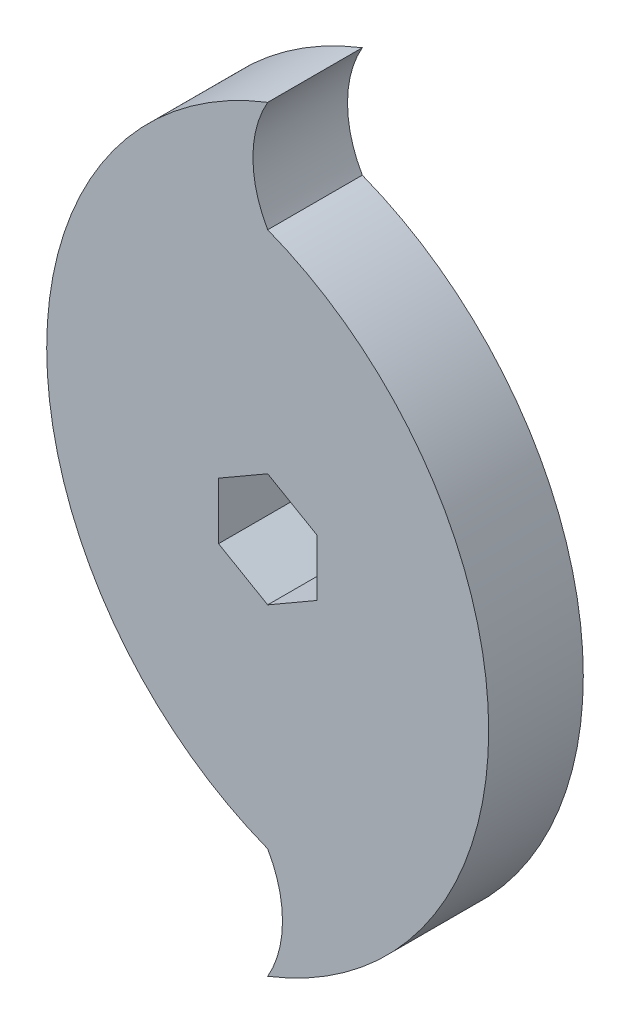
ISO-10303-21;
HEADER;
FILE_DESCRIPTION(('STEP AP214'),'2;1');
FILE_NAME('part.step','',(''),(''),'','','');
FILE_SCHEMA(('AUTOMOTIVE_DESIGN { 1 0 10303 214 1 1 1 1 }'));
ENDSEC;
DATA;
#1=APPLICATION_CONTEXT('core data for automotive mechanical design processes');
#2=APPLICATION_PROTOCOL_DEFINITION('international standard','automotive_design',2000,#1);
#3=PRODUCT_CONTEXT('',#1,'mechanical');
#4=PRODUCT('Part','Part','',(#3));
#5=PRODUCT_RELATED_PRODUCT_CATEGORY('part','',(#4));
#6=PRODUCT_DEFINITION_FORMATION('','',#4);
#7=PRODUCT_DEFINITION_CONTEXT('part definition',#1,'design');
#8=PRODUCT_DEFINITION('design','',#6,#7);
#9=PRODUCT_DEFINITION_SHAPE('','',#8);
#10=(LENGTH_UNIT() NAMED_UNIT(*) SI_UNIT(.MILLI.,.METRE.));
#11=(NAMED_UNIT(*) PLANE_ANGLE_UNIT() SI_UNIT($,.RADIAN.));
#12=(NAMED_UNIT(*) SI_UNIT($,.STERADIAN.) SOLID_ANGLE_UNIT());
#13=UNCERTAINTY_MEASURE_WITH_UNIT(LENGTH_MEASURE(1.E-05),#10,'distance_accuracy_value','');
#14=(GEOMETRIC_REPRESENTATION_CONTEXT(3) GLOBAL_UNCERTAINTY_ASSIGNED_CONTEXT((#13)) GLOBAL_UNIT_ASSIGNED_CONTEXT((#10,
#11,#12)) REPRESENTATION_CONTEXT('',''));
#15=CARTESIAN_POINT('',(0.,0.,0.));
#16=DIRECTION('',(0.,0.,1.));
#17=DIRECTION('',(1.,0.,0.));
#18=AXIS2_PLACEMENT_3D('',#15,#16,#17);
#19=CARTESIAN_POINT('',(30.3108891324554,-17.5,30.));
#20=DIRECTION('',(0.,0.,-1.));
#21=DIRECTION('',(-1.,0.,0.));
#22=AXIS2_PLACEMENT_3D('',#19,#20,#21);
#23=CYLINDRICAL_SURFACE('',#22,35.);
#24=CARTESIAN_POINT('',(30.3108891324554,-17.5,0.));
#25=DIRECTION('',(0.,0.,-1.));
#26=DIRECTION('',(-1.,0.,0.));
#27=AXIS2_PLACEMENT_3D('',#24,#25,#26);
#28=CIRCLE('',#27,35.);
#29=CARTESIAN_POINT('',(0.,-35.,0.));
#30=VERTEX_POINT('',#29);
#31=CARTESIAN_POINT('',(0.,0.,0.));
#32=VERTEX_POINT('',#31);
#33=EDGE_CURVE('E162',#30,#32,#28,.T.);
#34=ORIENTED_EDGE('',*,*,#33,.T.);
#35=DIRECTION('',(0.,0.,-1.));
#36=VECTOR('',#35,1.);
#37=CARTESIAN_POINT('',(0.,0.,30.));
#38=LINE('',#37,#36);
#39=CARTESIAN_POINT('',(0.,0.,30.));
#40=VERTEX_POINT('',#39);
#41=EDGE_CURVE('E11',#40,#32,#38,.T.);
#42=ORIENTED_EDGE('',*,*,#41,.F.);
#43=CARTESIAN_POINT('',(30.3108891324554,-17.5,30.));
#44=DIRECTION('',(0.,0.,-1.));
#45=DIRECTION('',(-1.,0.,0.));
#46=AXIS2_PLACEMENT_3D('',#43,#44,#45);
#47=CIRCLE('',#46,35.);
#48=CARTESIAN_POINT('',(0.,-35.,30.));
#49=VERTEX_POINT('',#48);
#50=EDGE_CURVE('E170',#49,#40,#47,.T.);
#51=ORIENTED_EDGE('',*,*,#50,.F.);
#52=DIRECTION('',(0.,0.,-1.));
#53=VECTOR('',#52,1.);
#54=CARTESIAN_POINT('',(0.,-35.,30.));
#55=LINE('',#54,#53);
#56=EDGE_CURVE('E180',#49,#30,#55,.T.);
#57=ORIENTED_EDGE('',*,*,#56,.T.);
#58=EDGE_LOOP('',(#34,#42,#51,#57));
#59=FACE_BOUND('',#58,.T.);
#60=ADVANCED_FACE('F41',(#59),#23,.F.);
#61=CARTESIAN_POINT('',(39.9217985566783,-102.5,30.));
#62=DIRECTION('',(0.,0.,-1.));
#63=DIRECTION('',(-1.,0.,0.));
#64=AXIS2_PLACEMENT_3D('',#61,#62,#63);
#65=CYLINDRICAL_SURFACE('',#64,110.);
#66=CARTESIAN_POINT('',(39.9217985566783,-102.5,0.));
#67=DIRECTION('',(0.,0.,1.));
#68=DIRECTION('',(-1.,0.,0.));
#69=AXIS2_PLACEMENT_3D('',#66,#67,#68);
#70=CIRCLE('',#69,110.);
#71=CARTESIAN_POINT('',(0.,-205.,0.));
#72=VERTEX_POINT('',#71);
#73=EDGE_CURVE('E183',#32,#72,#70,.T.);
#74=ORIENTED_EDGE('',*,*,#73,.T.);
#75=DIRECTION('',(0.,0.,-1.));
#76=VECTOR('',#75,1.);
#77=CARTESIAN_POINT('',(0.,-205.,30.));
#78=LINE('',#77,#76);
#79=CARTESIAN_POINT('',(0.,-205.,30.));
#80=VERTEX_POINT('',#79);
#81=EDGE_CURVE('E48',#80,#72,#78,.T.);
#82=ORIENTED_EDGE('',*,*,#81,.F.);
#83=CARTESIAN_POINT('',(39.9217985566783,-102.5,30.));
#84=DIRECTION('',(0.,0.,1.));
#85=DIRECTION('',(-1.,0.,0.));
#86=AXIS2_PLACEMENT_3D('',#83,#84,#85);
#87=CIRCLE('',#86,110.);
#88=EDGE_CURVE('E173',#40,#80,#87,.T.);
#89=ORIENTED_EDGE('',*,*,#88,.F.);
#90=ORIENTED_EDGE('',*,*,#41,.T.);
#91=EDGE_LOOP('',(#74,#82,#89,#90));
#92=FACE_BOUND('',#91,.T.);
#93=ADVANCED_FACE('F211',(#92),#65,.T.);
#94=CARTESIAN_POINT('',(-30.3108891324553,-222.5,30.));
#95=DIRECTION('',(0.,0.,-1.));
#96=DIRECTION('',(-1.,0.,0.));
#97=AXIS2_PLACEMENT_3D('',#94,#95,#96);
#98=CYLINDRICAL_SURFACE('',#97,35.);
#99=CARTESIAN_POINT('',(-30.3108891324553,-222.5,0.));
#100=DIRECTION('',(0.,0.,-1.));
#101=DIRECTION('',(-1.,0.,0.));
#102=AXIS2_PLACEMENT_3D('',#99,#100,#101);
#103=CIRCLE('',#102,35.);
#104=CARTESIAN_POINT('',(0.,-240.,0.));
#105=VERTEX_POINT('',#104);
#106=EDGE_CURVE('E185',#72,#105,#103,.T.);
#107=ORIENTED_EDGE('',*,*,#106,.T.);
#108=DIRECTION('',(0.,0.,-1.));
#109=VECTOR('',#108,1.);
#110=CARTESIAN_POINT('',(0.,-240.,30.));
#111=LINE('',#110,#109);
#112=CARTESIAN_POINT('',(0.,-240.,30.));
#113=VERTEX_POINT('',#112);
#114=EDGE_CURVE('E190',#113,#105,#111,.T.);
#115=ORIENTED_EDGE('',*,*,#114,.F.);
#116=CARTESIAN_POINT('',(-30.3108891324553,-222.5,30.));
#117=DIRECTION('',(0.,0.,-1.));
#118=DIRECTION('',(-1.,0.,0.));
#119=AXIS2_PLACEMENT_3D('',#116,#117,#118);
#120=CIRCLE('',#119,35.);
#121=EDGE_CURVE('E176',#80,#113,#120,.T.);
#122=ORIENTED_EDGE('',*,*,#121,.F.);
#123=ORIENTED_EDGE('',*,*,#81,.T.);
#124=EDGE_LOOP('',(#107,#115,#122,#123));
#125=FACE_BOUND('',#124,.T.);
#126=ADVANCED_FACE('F197',(#125),#98,.F.);
#127=CARTESIAN_POINT('',(-39.9217985566783,-137.5,30.));
#128=DIRECTION('',(0.,0.,-1.));
#129=DIRECTION('',(-1.,0.,0.));
#130=AXIS2_PLACEMENT_3D('',#127,#128,#129);
#131=CYLINDRICAL_SURFACE('',#130,110.);
#132=CARTESIAN_POINT('',(-39.9217985566783,-137.5,0.));
#133=DIRECTION('',(0.,0.,1.));
#134=DIRECTION('',(-1.,0.,0.));
#135=AXIS2_PLACEMENT_3D('',#132,#133,#134);
#136=CIRCLE('',#135,110.);
#137=EDGE_CURVE('E174',#105,#30,#136,.T.);
#138=ORIENTED_EDGE('',*,*,#137,.T.);
#139=ORIENTED_EDGE('',*,*,#56,.F.);
#140=CARTESIAN_POINT('',(-39.9217985566783,-137.5,30.));
#141=DIRECTION('',(0.,0.,1.));
#142=DIRECTION('',(-1.,0.,0.));
#143=AXIS2_PLACEMENT_3D('',#140,#141,#142);
#144=CIRCLE('',#143,110.);
#145=EDGE_CURVE('E178',#113,#49,#144,.T.);
#146=ORIENTED_EDGE('',*,*,#145,.F.);
#147=ORIENTED_EDGE('',*,*,#114,.T.);
#148=EDGE_LOOP('',(#138,#139,#146,#147));
#149=FACE_BOUND('',#148,.T.);
#150=ADVANCED_FACE('F204',(#149),#131,.T.);
#151=CARTESIAN_POINT('',(35.1163438445668,-60.,30.));
#152=DIRECTION('',(0.,0.,-1.));
#153=DIRECTION('',(-1.,0.,0.));
#154=AXIS2_PLACEMENT_3D('',#151,#152,#153);
#155=PLANE('',#154);
#156=DIRECTION('',(-0.866025403784439,0.5,0.));
#157=VECTOR('',#156,1.);
#158=CARTESIAN_POINT('',(15.5884572681199,-111.,30.));
#159=LINE('',#158,#157);
#160=CARTESIAN_POINT('',(15.5884572681199,-111.,30.));
#161=VERTEX_POINT('',#160);
#162=CARTESIAN_POINT('',(0.,-102.,30.));
#163=VERTEX_POINT('',#162);
#164=EDGE_CURVE('E150',#161,#163,#159,.T.);
#165=ORIENTED_EDGE('',*,*,#164,.F.);
#166=DIRECTION('',(0.,1.,0.));
#167=VECTOR('',#166,1.);
#168=CARTESIAN_POINT('',(15.58845726812,-129.,30.));
#169=LINE('',#168,#167);
#170=CARTESIAN_POINT('',(15.58845726812,-129.,30.));
#171=VERTEX_POINT('',#170);
#172=EDGE_CURVE('E55',#171,#161,#169,.T.);
#173=ORIENTED_EDGE('',*,*,#172,.F.);
#174=DIRECTION('',(0.866025403784439,0.5,0.));
#175=VECTOR('',#174,1.);
#176=CARTESIAN_POINT('',(0.,-138.,30.));
#177=LINE('',#176,#175);
#178=CARTESIAN_POINT('',(0.,-138.,30.));
#179=VERTEX_POINT('',#178);
#180=EDGE_CURVE('E136',#179,#171,#177,.T.);
#181=ORIENTED_EDGE('',*,*,#180,.F.);
#182=DIRECTION('',(0.866025403784438,-0.5,0.));
#183=VECTOR('',#182,1.);
#184=CARTESIAN_POINT('',(-15.5884572681198,-129.,30.));
#185=LINE('',#184,#183);
#186=CARTESIAN_POINT('',(-15.5884572681198,-129.,30.));
#187=VERTEX_POINT('',#186);
#188=EDGE_CURVE('E139',#187,#179,#185,.T.);
#189=ORIENTED_EDGE('',*,*,#188,.F.);
#190=DIRECTION('',(0.,-1.,0.));
#191=VECTOR('',#190,1.);
#192=CARTESIAN_POINT('',(-15.5884572681199,-111.,30.));
#193=LINE('',#192,#191);
#194=CARTESIAN_POINT('',(-15.5884572681199,-111.,30.));
#195=VERTEX_POINT('',#194);
#196=EDGE_CURVE('E155',#195,#187,#193,.T.);
#197=ORIENTED_EDGE('',*,*,#196,.F.);
#198=DIRECTION('',(-0.866025403784438,-0.500000000000001,0.));
#199=VECTOR('',#198,1.);
#200=CARTESIAN_POINT('',(0.,-102.,30.));
#201=LINE('',#200,#199);
#202=EDGE_CURVE('E152',#163,#195,#201,.T.);
#203=ORIENTED_EDGE('',*,*,#202,.F.);
#204=EDGE_LOOP('',(#165,#173,#181,#189,#197,#203));
#205=FACE_BOUND('',#204,.T.);
#206=ORIENTED_EDGE('',*,*,#50,.T.);
#207=ORIENTED_EDGE('',*,*,#88,.T.);
#208=ORIENTED_EDGE('',*,*,#121,.T.);
#209=ORIENTED_EDGE('',*,*,#145,.T.);
#210=EDGE_LOOP('',(#206,#207,#208,#209));
#211=FACE_BOUND('',#210,.T.);
#212=ADVANCED_FACE('F210',(#205,#211),#155,.F.);
#213=CARTESIAN_POINT('',(35.1163438445668,-60.,0.));
#214=DIRECTION('',(0.,0.,-1.));
#215=DIRECTION('',(-1.,0.,0.));
#216=AXIS2_PLACEMENT_3D('',#213,#214,#215);
#217=PLANE('',#216);
#218=DIRECTION('',(0.,1.,0.));
#219=VECTOR('',#218,1.);
#220=CARTESIAN_POINT('',(15.58845726812,-129.,0.));
#221=LINE('',#220,#219);
#222=CARTESIAN_POINT('',(15.58845726812,-129.,0.));
#223=VERTEX_POINT('',#222);
#224=CARTESIAN_POINT('',(15.5884572681199,-111.,0.));
#225=VERTEX_POINT('',#224);
#226=EDGE_CURVE('E119',#223,#225,#221,.T.);
#227=ORIENTED_EDGE('',*,*,#226,.T.);
#228=DIRECTION('',(-0.866025403784439,0.5,0.));
#229=VECTOR('',#228,1.);
#230=CARTESIAN_POINT('',(15.5884572681199,-111.,0.));
#231=LINE('',#230,#229);
#232=CARTESIAN_POINT('',(0.,-102.,0.));
#233=VERTEX_POINT('',#232);
#234=EDGE_CURVE('E128',#225,#233,#231,.T.);
#235=ORIENTED_EDGE('',*,*,#234,.T.);
#236=DIRECTION('',(-0.866025403784438,-0.500000000000001,0.));
#237=VECTOR('',#236,1.);
#238=CARTESIAN_POINT('',(0.,-102.,0.));
#239=LINE('',#238,#237);
#240=CARTESIAN_POINT('',(-15.5884572681199,-111.,0.));
#241=VERTEX_POINT('',#240);
#242=EDGE_CURVE('E63',#233,#241,#239,.T.);
#243=ORIENTED_EDGE('',*,*,#242,.T.);
#244=DIRECTION('',(0.,-1.,0.));
#245=VECTOR('',#244,1.);
#246=CARTESIAN_POINT('',(-15.5884572681199,-111.,0.));
#247=LINE('',#246,#245);
#248=CARTESIAN_POINT('',(-15.5884572681198,-129.,0.));
#249=VERTEX_POINT('',#248);
#250=EDGE_CURVE('E143',#241,#249,#247,.T.);
#251=ORIENTED_EDGE('',*,*,#250,.T.);
#252=DIRECTION('',(0.866025403784438,-0.5,0.));
#253=VECTOR('',#252,1.);
#254=CARTESIAN_POINT('',(-15.5884572681198,-129.,0.));
#255=LINE('',#254,#253);
#256=CARTESIAN_POINT('',(0.,-138.,0.));
#257=VERTEX_POINT('',#256);
#258=EDGE_CURVE('E146',#249,#257,#255,.T.);
#259=ORIENTED_EDGE('',*,*,#258,.T.);
#260=DIRECTION('',(0.866025403784439,0.5,0.));
#261=VECTOR('',#260,1.);
#262=CARTESIAN_POINT('',(0.,-138.,0.));
#263=LINE('',#262,#261);
#264=EDGE_CURVE('E125',#257,#223,#263,.T.);
#265=ORIENTED_EDGE('',*,*,#264,.T.);
#266=EDGE_LOOP('',(#227,#235,#243,#251,#259,#265));
#267=FACE_BOUND('',#266,.T.);
#268=ORIENTED_EDGE('',*,*,#33,.F.);
#269=ORIENTED_EDGE('',*,*,#137,.F.);
#270=ORIENTED_EDGE('',*,*,#106,.F.);
#271=ORIENTED_EDGE('',*,*,#73,.F.);
#272=EDGE_LOOP('',(#268,#269,#270,#271));
#273=FACE_BOUND('',#272,.T.);
#274=ADVANCED_FACE('F132',(#267,#273),#217,.T.);
#275=CARTESIAN_POINT('',(15.58845726812,-129.,0.));
#276=DIRECTION('',(1.,0.,0.));
#277=DIRECTION('',(0.,1.,0.));
#278=AXIS2_PLACEMENT_3D('',#275,#276,#277);
#279=PLANE('',#278);
#280=ORIENTED_EDGE('',*,*,#172,.T.);
#281=DIRECTION('',(0.,0.,1.));
#282=VECTOR('',#281,1.);
#283=CARTESIAN_POINT('',(15.5884572681199,-111.,0.));
#284=LINE('',#283,#282);
#285=EDGE_CURVE('E115',#225,#161,#284,.T.);
#286=ORIENTED_EDGE('',*,*,#285,.F.);
#287=ORIENTED_EDGE('',*,*,#226,.F.);
#288=DIRECTION('',(0.,0.,1.));
#289=VECTOR('',#288,1.);
#290=CARTESIAN_POINT('',(15.58845726812,-129.,0.));
#291=LINE('',#290,#289);
#292=EDGE_CURVE('E160',#223,#171,#291,.T.);
#293=ORIENTED_EDGE('',*,*,#292,.T.);
#294=EDGE_LOOP('',(#280,#286,#287,#293));
#295=FACE_BOUND('',#294,.T.);
#296=ADVANCED_FACE('F117',(#295),#279,.F.);
#297=CARTESIAN_POINT('',(0.,-138.,0.));
#298=DIRECTION('',(0.5,-0.866025403784439,0.));
#299=DIRECTION('',(0.866025403784439,0.5,0.));
#300=AXIS2_PLACEMENT_3D('',#297,#298,#299);
#301=PLANE('',#300);
#302=ORIENTED_EDGE('',*,*,#180,.T.);
#303=ORIENTED_EDGE('',*,*,#292,.F.);
#304=ORIENTED_EDGE('',*,*,#264,.F.);
#305=DIRECTION('',(0.,0.,1.));
#306=VECTOR('',#305,1.);
#307=CARTESIAN_POINT('',(0.,-138.,0.));
#308=LINE('',#307,#306);
#309=EDGE_CURVE('E163',#257,#179,#308,.T.);
#310=ORIENTED_EDGE('',*,*,#309,.T.);
#311=EDGE_LOOP('',(#302,#303,#304,#310));
#312=FACE_BOUND('',#311,.T.);
#313=ADVANCED_FACE('F228',(#312),#301,.F.);
#314=CARTESIAN_POINT('',(-15.5884572681198,-129.,0.));
#315=DIRECTION('',(-0.5,-0.866025403784438,0.));
#316=DIRECTION('',(0.866025403784439,-0.5,0.));
#317=AXIS2_PLACEMENT_3D('',#314,#315,#316);
#318=PLANE('',#317);
#319=ORIENTED_EDGE('',*,*,#188,.T.);
#320=ORIENTED_EDGE('',*,*,#309,.F.);
#321=ORIENTED_EDGE('',*,*,#258,.F.);
#322=DIRECTION('',(0.,0.,1.));
#323=VECTOR('',#322,1.);
#324=CARTESIAN_POINT('',(-15.5884572681198,-129.,0.));
#325=LINE('',#324,#323);
#326=EDGE_CURVE('E165',#249,#187,#325,.T.);
#327=ORIENTED_EDGE('',*,*,#326,.T.);
#328=EDGE_LOOP('',(#319,#320,#321,#327));
#329=FACE_BOUND('',#328,.T.);
#330=ADVANCED_FACE('F237',(#329),#318,.F.);
#331=CARTESIAN_POINT('',(-15.5884572681199,-111.,0.));
#332=DIRECTION('',(-1.,0.,0.));
#333=DIRECTION('',(0.,-1.,0.));
#334=AXIS2_PLACEMENT_3D('',#331,#332,#333);
#335=PLANE('',#334);
#336=ORIENTED_EDGE('',*,*,#196,.T.);
#337=ORIENTED_EDGE('',*,*,#326,.F.);
#338=ORIENTED_EDGE('',*,*,#250,.F.);
#339=DIRECTION('',(0.,0.,1.));
#340=VECTOR('',#339,1.);
#341=CARTESIAN_POINT('',(-15.5884572681199,-111.,0.));
#342=LINE('',#341,#340);
#343=EDGE_CURVE('E167',#241,#195,#342,.T.);
#344=ORIENTED_EDGE('',*,*,#343,.T.);
#345=EDGE_LOOP('',(#336,#337,#338,#344));
#346=FACE_BOUND('',#345,.T.);
#347=ADVANCED_FACE('F234',(#346),#335,.F.);
#348=CARTESIAN_POINT('',(0.,-102.,0.));
#349=DIRECTION('',(-0.500000000000001,0.866025403784438,0.));
#350=DIRECTION('',(-0.866025403784438,-0.500000000000001,0.));
#351=AXIS2_PLACEMENT_3D('',#348,#349,#350);
#352=PLANE('',#351);
#353=ORIENTED_EDGE('',*,*,#202,.T.);
#354=ORIENTED_EDGE('',*,*,#343,.F.);
#355=ORIENTED_EDGE('',*,*,#242,.F.);
#356=DIRECTION('',(0.,0.,1.));
#357=VECTOR('',#356,1.);
#358=CARTESIAN_POINT('',(0.,-102.,0.));
#359=LINE('',#358,#357);
#360=EDGE_CURVE('E124',#233,#163,#359,.T.);
#361=ORIENTED_EDGE('',*,*,#360,.T.);
#362=EDGE_LOOP('',(#353,#354,#355,#361));
#363=FACE_BOUND('',#362,.T.);
#364=ADVANCED_FACE('F231',(#363),#352,.F.);
#365=CARTESIAN_POINT('',(15.5884572681199,-111.,0.));
#366=DIRECTION('',(0.5,0.866025403784439,0.));
#367=DIRECTION('',(-0.866025403784439,0.5,0.));
#368=AXIS2_PLACEMENT_3D('',#365,#366,#367);
#369=PLANE('',#368);
#370=ORIENTED_EDGE('',*,*,#164,.T.);
#371=ORIENTED_EDGE('',*,*,#360,.F.);
#372=ORIENTED_EDGE('',*,*,#234,.F.);
#373=ORIENTED_EDGE('',*,*,#285,.T.);
#374=EDGE_LOOP('',(#370,#371,#372,#373));
#375=FACE_BOUND('',#374,.T.);
#376=ADVANCED_FACE('F129',(#375),#369,.F.);
#377=CLOSED_SHELL('',(#60,#93,#126,#150,#212,#274,#296,#313,#330,#347,#364,#376));
#378=MANIFOLD_SOLID_BREP('B2',#377);
#379=ADVANCED_BREP_SHAPE_REPRESENTATION('',(#18,#378),#14);
#380=SHAPE_DEFINITION_REPRESENTATION(#9,#379);
ENDSEC;
END-ISO-10303-21;
